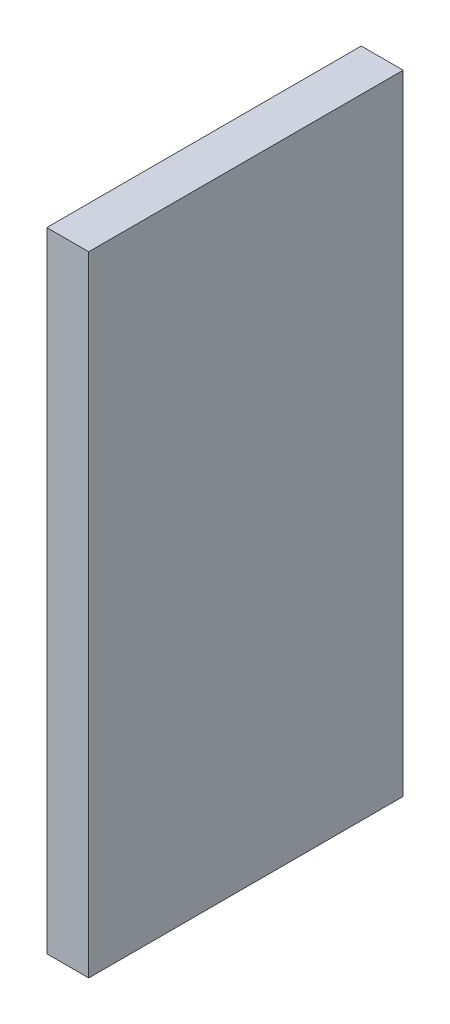
ISO-10303-21;
HEADER;
FILE_DESCRIPTION(('STEP AP214'),'2;1');
FILE_NAME('part.step','',(''),(''),'','','');
FILE_SCHEMA(('AUTOMOTIVE_DESIGN { 1 0 10303 214 1 1 1 1 }'));
ENDSEC;
DATA;
#1=APPLICATION_CONTEXT('core data for automotive mechanical design processes');
#2=APPLICATION_PROTOCOL_DEFINITION('international standard','automotive_design',2000,#1);
#3=PRODUCT_CONTEXT('',#1,'mechanical');
#4=PRODUCT('Part','Part','',(#3));
#5=PRODUCT_RELATED_PRODUCT_CATEGORY('part','',(#4));
#6=PRODUCT_DEFINITION_FORMATION('','',#4);
#7=PRODUCT_DEFINITION_CONTEXT('part definition',#1,'design');
#8=PRODUCT_DEFINITION('design','',#6,#7);
#9=PRODUCT_DEFINITION_SHAPE('','',#8);
#10=(LENGTH_UNIT() NAMED_UNIT(*) SI_UNIT(.MILLI.,.METRE.));
#11=(NAMED_UNIT(*) PLANE_ANGLE_UNIT() SI_UNIT($,.RADIAN.));
#12=(NAMED_UNIT(*) SI_UNIT($,.STERADIAN.) SOLID_ANGLE_UNIT());
#13=UNCERTAINTY_MEASURE_WITH_UNIT(LENGTH_MEASURE(1.E-05),#10,'distance_accuracy_value','');
#14=(GEOMETRIC_REPRESENTATION_CONTEXT(3) GLOBAL_UNCERTAINTY_ASSIGNED_CONTEXT((#13)) GLOBAL_UNIT_ASSIGNED_CONTEXT((#10,
#11,#12)) REPRESENTATION_CONTEXT('',''));
#15=CARTESIAN_POINT('',(0.,0.,0.));
#16=DIRECTION('',(0.,0.,1.));
#17=DIRECTION('',(1.,0.,0.));
#18=AXIS2_PLACEMENT_3D('',#15,#16,#17);
#19=CARTESIAN_POINT('',(0.,60.,0.));
#20=DIRECTION('',(0.,0.,-1.));
#21=DIRECTION('',(-1.,0.,0.));
#22=AXIS2_PLACEMENT_3D('',#19,#20,#21);
#23=PLANE('',#22);
#24=DIRECTION('',(1.,0.,0.));
#25=VECTOR('',#24,1.);
#26=CARTESIAN_POINT('',(0.,0.,0.));
#27=LINE('',#26,#25);
#28=CARTESIAN_POINT('',(0.,0.,0.));
#29=VERTEX_POINT('',#28);
#30=CARTESIAN_POINT('',(4.,0.,0.));
#31=VERTEX_POINT('',#30);
#32=EDGE_CURVE('E96',#29,#31,#27,.T.);
#33=ORIENTED_EDGE('',*,*,#32,.T.);
#34=DIRECTION('',(0.,-1.,0.));
#35=VECTOR('',#34,1.);
#36=CARTESIAN_POINT('',(4.,60.,0.));
#37=LINE('',#36,#35);
#38=CARTESIAN_POINT('',(4.,60.,0.));
#39=VERTEX_POINT('',#38);
#40=EDGE_CURVE('E11',#39,#31,#37,.T.);
#41=ORIENTED_EDGE('',*,*,#40,.F.);
#42=DIRECTION('',(1.,0.,0.));
#43=VECTOR('',#42,1.);
#44=CARTESIAN_POINT('',(0.,60.,0.));
#45=LINE('',#44,#43);
#46=CARTESIAN_POINT('',(0.,60.,0.));
#47=VERTEX_POINT('',#46);
#48=EDGE_CURVE('E82',#47,#39,#45,.T.);
#49=ORIENTED_EDGE('',*,*,#48,.F.);
#50=DIRECTION('',(0.,-1.,0.));
#51=VECTOR('',#50,1.);
#52=CARTESIAN_POINT('',(0.,60.,0.));
#53=LINE('',#52,#51);
#54=EDGE_CURVE('E49',#47,#29,#53,.T.);
#55=ORIENTED_EDGE('',*,*,#54,.T.);
#56=EDGE_LOOP('',(#33,#41,#49,#55));
#57=FACE_BOUND('',#56,.T.);
#58=ADVANCED_FACE('F33',(#57),#23,.F.);
#59=CARTESIAN_POINT('',(4.,60.,0.));
#60=DIRECTION('',(-1.,0.,0.));
#61=DIRECTION('',(0.,0.,1.));
#62=AXIS2_PLACEMENT_3D('',#59,#60,#61);
#63=PLANE('',#62);
#64=DIRECTION('',(0.,0.,-1.));
#65=VECTOR('',#64,1.);
#66=CARTESIAN_POINT('',(4.,0.,0.));
#67=LINE('',#66,#65);
#68=CARTESIAN_POINT('',(4.,0.,-30.));
#69=VERTEX_POINT('',#68);
#70=EDGE_CURVE('E87',#31,#69,#67,.T.);
#71=ORIENTED_EDGE('',*,*,#70,.T.);
#72=DIRECTION('',(0.,-1.,0.));
#73=VECTOR('',#72,1.);
#74=CARTESIAN_POINT('',(4.,60.,-30.));
#75=LINE('',#74,#73);
#76=CARTESIAN_POINT('',(4.,60.,-30.));
#77=VERTEX_POINT('',#76);
#78=EDGE_CURVE('E41',#77,#69,#75,.T.);
#79=ORIENTED_EDGE('',*,*,#78,.F.);
#80=DIRECTION('',(0.,0.,-1.));
#81=VECTOR('',#80,1.);
#82=CARTESIAN_POINT('',(4.,60.,0.));
#83=LINE('',#82,#81);
#84=EDGE_CURVE('E74',#39,#77,#83,.T.);
#85=ORIENTED_EDGE('',*,*,#84,.F.);
#86=ORIENTED_EDGE('',*,*,#40,.T.);
#87=EDGE_LOOP('',(#71,#79,#85,#86));
#88=FACE_BOUND('',#87,.T.);
#89=ADVANCED_FACE('F86',(#88),#63,.F.);
#90=CARTESIAN_POINT('',(0.,60.,-30.));
#91=DIRECTION('',(0.,0.,-1.));
#92=DIRECTION('',(-1.,0.,0.));
#93=AXIS2_PLACEMENT_3D('',#90,#91,#92);
#94=PLANE('',#93);
#95=DIRECTION('',(1.,0.,0.));
#96=VECTOR('',#95,1.);
#97=CARTESIAN_POINT('',(0.,0.,-30.));
#98=LINE('',#97,#96);
#99=CARTESIAN_POINT('',(0.,0.,-30.));
#100=VERTEX_POINT('',#99);
#101=EDGE_CURVE('E99',#100,#69,#98,.T.);
#102=ORIENTED_EDGE('',*,*,#101,.F.);
#103=DIRECTION('',(0.,-1.,0.));
#104=VECTOR('',#103,1.);
#105=CARTESIAN_POINT('',(0.,60.,-30.));
#106=LINE('',#105,#104);
#107=CARTESIAN_POINT('',(0.,60.,-30.));
#108=VERTEX_POINT('',#107);
#109=EDGE_CURVE('E63',#108,#100,#106,.T.);
#110=ORIENTED_EDGE('',*,*,#109,.F.);
#111=DIRECTION('',(1.,0.,0.));
#112=VECTOR('',#111,1.);
#113=CARTESIAN_POINT('',(0.,60.,-30.));
#114=LINE('',#113,#112);
#115=EDGE_CURVE('E81',#108,#77,#114,.T.);
#116=ORIENTED_EDGE('',*,*,#115,.T.);
#117=ORIENTED_EDGE('',*,*,#78,.T.);
#118=EDGE_LOOP('',(#102,#110,#116,#117));
#119=FACE_BOUND('',#118,.T.);
#120=ADVANCED_FACE('F90',(#119),#94,.T.);
#121=CARTESIAN_POINT('',(0.,60.,0.));
#122=DIRECTION('',(-1.,0.,0.));
#123=DIRECTION('',(0.,0.,1.));
#124=AXIS2_PLACEMENT_3D('',#121,#122,#123);
#125=PLANE('',#124);
#126=DIRECTION('',(0.,0.,-1.));
#127=VECTOR('',#126,1.);
#128=CARTESIAN_POINT('',(0.,0.,0.));
#129=LINE('',#128,#127);
#130=EDGE_CURVE('E101',#29,#100,#129,.T.);
#131=ORIENTED_EDGE('',*,*,#130,.F.);
#132=ORIENTED_EDGE('',*,*,#54,.F.);
#133=DIRECTION('',(0.,0.,-1.));
#134=VECTOR('',#133,1.);
#135=CARTESIAN_POINT('',(0.,60.,0.));
#136=LINE('',#135,#134);
#137=EDGE_CURVE('E91',#47,#108,#136,.T.);
#138=ORIENTED_EDGE('',*,*,#137,.T.);
#139=ORIENTED_EDGE('',*,*,#109,.T.);
#140=EDGE_LOOP('',(#131,#132,#138,#139));
#141=FACE_BOUND('',#140,.T.);
#142=ADVANCED_FACE('F107',(#141),#125,.T.);
#143=CARTESIAN_POINT('',(0.,60.,0.));
#144=DIRECTION('',(0.,1.,0.));
#145=DIRECTION('',(0.,0.,1.));
#146=AXIS2_PLACEMENT_3D('',#143,#144,#145);
#147=PLANE('',#146);
#148=ORIENTED_EDGE('',*,*,#48,.T.);
#149=ORIENTED_EDGE('',*,*,#84,.T.);
#150=ORIENTED_EDGE('',*,*,#115,.F.);
#151=ORIENTED_EDGE('',*,*,#137,.F.);
#152=EDGE_LOOP('',(#148,#149,#150,#151));
#153=FACE_BOUND('',#152,.T.);
#154=ADVANCED_FACE('F78',(#153),#147,.T.);
#155=CARTESIAN_POINT('',(0.,0.,0.));
#156=DIRECTION('',(0.,1.,0.));
#157=DIRECTION('',(0.,0.,1.));
#158=AXIS2_PLACEMENT_3D('',#155,#156,#157);
#159=PLANE('',#158);
#160=ORIENTED_EDGE('',*,*,#32,.F.);
#161=ORIENTED_EDGE('',*,*,#130,.T.);
#162=ORIENTED_EDGE('',*,*,#101,.T.);
#163=ORIENTED_EDGE('',*,*,#70,.F.);
#164=EDGE_LOOP('',(#160,#161,#162,#163));
#165=FACE_BOUND('',#164,.T.);
#166=ADVANCED_FACE('F106',(#165),#159,.F.);
#167=CLOSED_SHELL('',(#58,#89,#120,#142,#154,#166));
#168=MANIFOLD_SOLID_BREP('B2',#167);
#169=ADVANCED_BREP_SHAPE_REPRESENTATION('',(#18,#168),#14);
#170=SHAPE_DEFINITION_REPRESENTATION(#9,#169);
ENDSEC;
END-ISO-10303-21;
